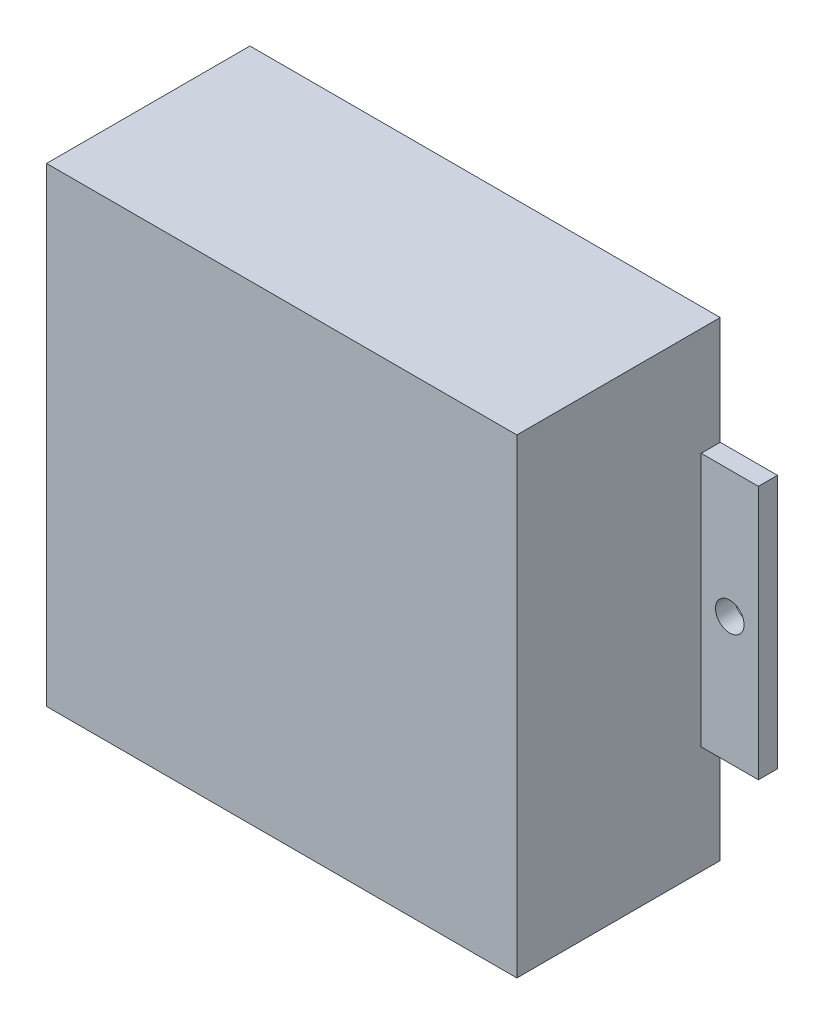
ISO-10303-21;
HEADER;
FILE_DESCRIPTION(('STEP AP214'),'2;1');
FILE_NAME('part.step','',(''),(''),'','','');
FILE_SCHEMA(('AUTOMOTIVE_DESIGN { 1 0 10303 214 1 1 1 1 }'));
ENDSEC;
DATA;
#1=APPLICATION_CONTEXT('core data for automotive mechanical design processes');
#2=APPLICATION_PROTOCOL_DEFINITION('international standard','automotive_design',2000,#1);
#3=PRODUCT_CONTEXT('',#1,'mechanical');
#4=PRODUCT('Part','Part','',(#3));
#5=PRODUCT_RELATED_PRODUCT_CATEGORY('part','',(#4));
#6=PRODUCT_DEFINITION_FORMATION('','',#4);
#7=PRODUCT_DEFINITION_CONTEXT('part definition',#1,'design');
#8=PRODUCT_DEFINITION('design','',#6,#7);
#9=PRODUCT_DEFINITION_SHAPE('','',#8);
#10=(LENGTH_UNIT() NAMED_UNIT(*) SI_UNIT(.MILLI.,.METRE.));
#11=(NAMED_UNIT(*) PLANE_ANGLE_UNIT() SI_UNIT($,.RADIAN.));
#12=(NAMED_UNIT(*) SI_UNIT($,.STERADIAN.) SOLID_ANGLE_UNIT());
#13=UNCERTAINTY_MEASURE_WITH_UNIT(LENGTH_MEASURE(1.E-05),#10,'distance_accuracy_value','');
#14=(GEOMETRIC_REPRESENTATION_CONTEXT(3) GLOBAL_UNCERTAINTY_ASSIGNED_CONTEXT((#13)) GLOBAL_UNIT_ASSIGNED_CONTEXT((#10,
#11,#12)) REPRESENTATION_CONTEXT('',''));
#15=CARTESIAN_POINT('',(0.,0.,0.));
#16=DIRECTION('',(0.,0.,1.));
#17=DIRECTION('',(1.,0.,0.));
#18=AXIS2_PLACEMENT_3D('',#15,#16,#17);
#19=CARTESIAN_POINT('',(41.5,-165.,188.8));
#20=DIRECTION('',(0.,0.,1.));
#21=DIRECTION('',(1.,0.,0.));
#22=AXIS2_PLACEMENT_3D('',#19,#20,#21);
#23=CYLINDRICAL_SURFACE('',#22,2.25);
#24=DIRECTION('',(0.,0.,1.));
#25=VECTOR('',#24,1.);
#26=CARTESIAN_POINT('',(43.75,-165.,188.8));
#27=LINE('',#26,#25);
#28=CARTESIAN_POINT('',(43.75,-165.,189.));
#29=VERTEX_POINT('',#28);
#30=CARTESIAN_POINT('',(43.75,-165.,192.));
#31=VERTEX_POINT('',#30);
#32=EDGE_CURVE('E10',#29,#31,#27,.T.);
#33=ORIENTED_EDGE('',*,*,#32,.F.);
#34=CARTESIAN_POINT('',(41.5,-165.,189.));
#35=DIRECTION('',(0.,0.,1.));
#36=DIRECTION('',(1.,0.,0.));
#37=AXIS2_PLACEMENT_3D('',#34,#35,#36);
#38=CIRCLE('',#37,2.25);
#39=EDGE_CURVE('E156',#29,#29,#38,.T.);
#40=ORIENTED_EDGE('',*,*,#39,.F.);
#41=ORIENTED_EDGE('',*,*,#32,.T.);
#42=CARTESIAN_POINT('',(41.5,-165.,192.));
#43=DIRECTION('',(0.,0.,1.));
#44=DIRECTION('',(1.,0.,0.));
#45=AXIS2_PLACEMENT_3D('',#42,#43,#44);
#46=CIRCLE('',#45,2.25);
#47=EDGE_CURVE('E249',#31,#31,#46,.T.);
#48=ORIENTED_EDGE('',*,*,#47,.T.);
#49=EDGE_LOOP('',(#33,#40,#41,#48));
#50=FACE_BOUND('',#49,.T.);
#51=ADVANCED_FACE('F15',(#50),#23,.F.);
#52=CARTESIAN_POINT('',(46.,-185.,189.));
#53=DIRECTION('',(1.,0.,0.));
#54=DIRECTION('',(0.,1.,0.));
#55=AXIS2_PLACEMENT_3D('',#52,#53,#54);
#56=PLANE('',#55);
#57=DIRECTION('',(0.,0.,1.));
#58=VECTOR('',#57,1.);
#59=CARTESIAN_POINT('',(46.,-185.,189.));
#60=LINE('',#59,#58);
#61=CARTESIAN_POINT('',(46.,-185.,189.));
#62=VERTEX_POINT('',#61);
#63=CARTESIAN_POINT('',(46.,-185.,192.));
#64=VERTEX_POINT('',#63);
#65=EDGE_CURVE('E26',#62,#64,#60,.T.);
#66=ORIENTED_EDGE('',*,*,#65,.F.);
#67=DIRECTION('',(0.,1.,0.));
#68=VECTOR('',#67,1.);
#69=CARTESIAN_POINT('',(46.,-185.,189.));
#70=LINE('',#69,#68);
#71=CARTESIAN_POINT('',(46.,-145.,189.));
#72=VERTEX_POINT('',#71);
#73=EDGE_CURVE('E186',#62,#72,#70,.T.);
#74=ORIENTED_EDGE('',*,*,#73,.T.);
#75=DIRECTION('',(0.,0.,1.));
#76=VECTOR('',#75,1.);
#77=CARTESIAN_POINT('',(46.,-145.,189.));
#78=LINE('',#77,#76);
#79=CARTESIAN_POINT('',(46.,-145.,192.));
#80=VERTEX_POINT('',#79);
#81=EDGE_CURVE('E209',#72,#80,#78,.T.);
#82=ORIENTED_EDGE('',*,*,#81,.T.);
#83=DIRECTION('',(0.,1.,0.));
#84=VECTOR('',#83,1.);
#85=CARTESIAN_POINT('',(46.,-185.,192.));
#86=LINE('',#85,#84);
#87=EDGE_CURVE('E247',#64,#80,#86,.T.);
#88=ORIENTED_EDGE('',*,*,#87,.F.);
#89=EDGE_LOOP('',(#66,#74,#82,#88));
#90=FACE_BOUND('',#89,.T.);
#91=ADVANCED_FACE('F352',(#90),#56,.T.);
#92=CARTESIAN_POINT('',(37.,-185.,189.));
#93=DIRECTION('',(0.,1.,0.));
#94=DIRECTION('',(1.,0.,0.));
#95=AXIS2_PLACEMENT_3D('',#92,#93,#94);
#96=PLANE('',#95);
#97=ORIENTED_EDGE('',*,*,#65,.T.);
#98=DIRECTION('',(1.,0.,0.));
#99=VECTOR('',#98,1.);
#100=CARTESIAN_POINT('',(37.,-185.,192.));
#101=LINE('',#100,#99);
#102=CARTESIAN_POINT('',(37.,-185.,192.));
#103=VERTEX_POINT('',#102);
#104=EDGE_CURVE('E222',#103,#64,#101,.T.);
#105=ORIENTED_EDGE('',*,*,#104,.F.);
#106=DIRECTION('',(0.,0.,1.));
#107=VECTOR('',#106,1.);
#108=CARTESIAN_POINT('',(37.,-185.,189.));
#109=LINE('',#108,#107);
#110=CARTESIAN_POINT('',(37.,-185.,189.));
#111=VERTEX_POINT('',#110);
#112=EDGE_CURVE('E237',#111,#103,#109,.T.);
#113=ORIENTED_EDGE('',*,*,#112,.F.);
#114=DIRECTION('',(1.,0.,0.));
#115=VECTOR('',#114,1.);
#116=CARTESIAN_POINT('',(37.,-185.,189.));
#117=LINE('',#116,#115);
#118=EDGE_CURVE('E262',#111,#62,#117,.T.);
#119=ORIENTED_EDGE('',*,*,#118,.T.);
#120=EDGE_LOOP('',(#97,#105,#113,#119));
#121=FACE_BOUND('',#120,.T.);
#122=ADVANCED_FACE('F17',(#121),#96,.F.);
#123=CARTESIAN_POINT('',(37.,-185.,192.));
#124=DIRECTION('',(0.,0.,1.));
#125=DIRECTION('',(1.,0.,0.));
#126=AXIS2_PLACEMENT_3D('',#123,#124,#125);
#127=PLANE('',#126);
#128=ORIENTED_EDGE('',*,*,#47,.F.);
#129=EDGE_LOOP('',(#128));
#130=FACE_BOUND('',#129,.T.);
#131=DIRECTION('',(0.,1.,0.));
#132=VECTOR('',#131,1.);
#133=CARTESIAN_POINT('',(37.,-185.,192.));
#134=LINE('',#133,#132);
#135=CARTESIAN_POINT('',(37.,-145.,192.));
#136=VERTEX_POINT('',#135);
#137=EDGE_CURVE('E233',#103,#136,#134,.T.);
#138=ORIENTED_EDGE('',*,*,#137,.F.);
#139=ORIENTED_EDGE('',*,*,#104,.T.);
#140=ORIENTED_EDGE('',*,*,#87,.T.);
#141=DIRECTION('',(1.,0.,0.));
#142=VECTOR('',#141,1.);
#143=CARTESIAN_POINT('',(37.,-145.,192.));
#144=LINE('',#143,#142);
#145=EDGE_CURVE('E149',#136,#80,#144,.T.);
#146=ORIENTED_EDGE('',*,*,#145,.F.);
#147=EDGE_LOOP('',(#138,#139,#140,#146));
#148=FACE_BOUND('',#147,.T.);
#149=ADVANCED_FACE('F297',(#130,#148),#127,.T.);
#150=CARTESIAN_POINT('',(37.,-145.,189.));
#151=DIRECTION('',(0.,1.,0.));
#152=DIRECTION('',(1.,0.,0.));
#153=AXIS2_PLACEMENT_3D('',#150,#151,#152);
#154=PLANE('',#153);
#155=DIRECTION('',(1.,0.,0.));
#156=VECTOR('',#155,1.);
#157=CARTESIAN_POINT('',(37.,-145.,189.));
#158=LINE('',#157,#156);
#159=CARTESIAN_POINT('',(37.,-145.,189.));
#160=VERTEX_POINT('',#159);
#161=EDGE_CURVE('E182',#160,#72,#158,.T.);
#162=ORIENTED_EDGE('',*,*,#161,.F.);
#163=DIRECTION('',(0.,0.,1.));
#164=VECTOR('',#163,1.);
#165=CARTESIAN_POINT('',(37.,-145.,189.));
#166=LINE('',#165,#164);
#167=EDGE_CURVE('E150',#160,#136,#166,.T.);
#168=ORIENTED_EDGE('',*,*,#167,.T.);
#169=ORIENTED_EDGE('',*,*,#145,.T.);
#170=ORIENTED_EDGE('',*,*,#81,.F.);
#171=EDGE_LOOP('',(#162,#168,#169,#170));
#172=FACE_BOUND('',#171,.T.);
#173=ADVANCED_FACE('F300',(#172),#154,.T.);
#174=CARTESIAN_POINT('',(-41.5,-165.,188.8));
#175=DIRECTION('',(0.,0.,1.));
#176=DIRECTION('',(1.,0.,0.));
#177=AXIS2_PLACEMENT_3D('',#174,#175,#176);
#178=CYLINDRICAL_SURFACE('',#177,2.25);
#179=DIRECTION('',(0.,0.,1.));
#180=VECTOR('',#179,1.);
#181=CARTESIAN_POINT('',(-39.25,-165.,188.8));
#182=LINE('',#181,#180);
#183=CARTESIAN_POINT('',(-39.25,-165.,189.));
#184=VERTEX_POINT('',#183);
#185=CARTESIAN_POINT('',(-39.25,-165.,192.));
#186=VERTEX_POINT('',#185);
#187=EDGE_CURVE('E142',#184,#186,#182,.T.);
#188=ORIENTED_EDGE('',*,*,#187,.F.);
#189=CARTESIAN_POINT('',(-41.5,-165.,189.));
#190=DIRECTION('',(0.,0.,1.));
#191=DIRECTION('',(1.,0.,0.));
#192=AXIS2_PLACEMENT_3D('',#189,#190,#191);
#193=CIRCLE('',#192,2.25);
#194=EDGE_CURVE('E145',#184,#184,#193,.T.);
#195=ORIENTED_EDGE('',*,*,#194,.F.);
#196=ORIENTED_EDGE('',*,*,#187,.T.);
#197=CARTESIAN_POINT('',(-41.5,-165.,192.));
#198=DIRECTION('',(0.,0.,1.));
#199=DIRECTION('',(1.,0.,0.));
#200=AXIS2_PLACEMENT_3D('',#197,#198,#199);
#201=CIRCLE('',#200,2.25);
#202=EDGE_CURVE('E147',#186,#186,#201,.T.);
#203=ORIENTED_EDGE('',*,*,#202,.T.);
#204=EDGE_LOOP('',(#188,#195,#196,#203));
#205=FACE_BOUND('',#204,.T.);
#206=ADVANCED_FACE('F144',(#205),#178,.F.);
#207=CARTESIAN_POINT('',(-46.,-185.,189.));
#208=DIRECTION('',(1.,0.,0.));
#209=DIRECTION('',(0.,1.,0.));
#210=AXIS2_PLACEMENT_3D('',#207,#208,#209);
#211=PLANE('',#210);
#212=DIRECTION('',(0.,1.,0.));
#213=VECTOR('',#212,1.);
#214=CARTESIAN_POINT('',(-46.,-185.,192.));
#215=LINE('',#214,#213);
#216=CARTESIAN_POINT('',(-46.,-185.,192.));
#217=VERTEX_POINT('',#216);
#218=CARTESIAN_POINT('',(-46.,-145.,192.));
#219=VERTEX_POINT('',#218);
#220=EDGE_CURVE('E174',#217,#219,#215,.T.);
#221=ORIENTED_EDGE('',*,*,#220,.T.);
#222=DIRECTION('',(0.,0.,1.));
#223=VECTOR('',#222,1.);
#224=CARTESIAN_POINT('',(-46.,-145.,189.));
#225=LINE('',#224,#223);
#226=CARTESIAN_POINT('',(-46.,-145.,189.));
#227=VERTEX_POINT('',#226);
#228=EDGE_CURVE('E164',#227,#219,#225,.T.);
#229=ORIENTED_EDGE('',*,*,#228,.F.);
#230=DIRECTION('',(0.,1.,0.));
#231=VECTOR('',#230,1.);
#232=CARTESIAN_POINT('',(-46.,-185.,189.));
#233=LINE('',#232,#231);
#234=CARTESIAN_POINT('',(-46.,-185.,189.));
#235=VERTEX_POINT('',#234);
#236=EDGE_CURVE('E275',#235,#227,#233,.T.);
#237=ORIENTED_EDGE('',*,*,#236,.F.);
#238=DIRECTION('',(0.,0.,1.));
#239=VECTOR('',#238,1.);
#240=CARTESIAN_POINT('',(-46.,-185.,189.));
#241=LINE('',#240,#239);
#242=EDGE_CURVE('E254',#235,#217,#241,.T.);
#243=ORIENTED_EDGE('',*,*,#242,.T.);
#244=EDGE_LOOP('',(#221,#229,#237,#243));
#245=FACE_BOUND('',#244,.T.);
#246=ADVANCED_FACE('F338',(#245),#211,.F.);
#247=CARTESIAN_POINT('',(37.,-202.,189.));
#248=DIRECTION('',(1.,0.,0.));
#249=DIRECTION('',(0.,1.,0.));
#250=AXIS2_PLACEMENT_3D('',#247,#248,#249);
#251=PLANE('',#250);
#252=DIRECTION('',(0.,1.,0.));
#253=VECTOR('',#252,1.);
#254=CARTESIAN_POINT('',(37.,-202.,221.));
#255=LINE('',#254,#253);
#256=CARTESIAN_POINT('',(37.,-202.,221.));
#257=VERTEX_POINT('',#256);
#258=CARTESIAN_POINT('',(37.,-128.,221.));
#259=VERTEX_POINT('',#258);
#260=EDGE_CURVE('E205',#257,#259,#255,.T.);
#261=ORIENTED_EDGE('',*,*,#260,.F.);
#262=DIRECTION('',(0.,0.,1.));
#263=VECTOR('',#262,1.);
#264=CARTESIAN_POINT('',(37.,-202.,189.));
#265=LINE('',#264,#263);
#266=CARTESIAN_POINT('',(37.,-202.,189.));
#267=VERTEX_POINT('',#266);
#268=EDGE_CURVE('E251',#267,#257,#265,.T.);
#269=ORIENTED_EDGE('',*,*,#268,.F.);
#270=DIRECTION('',(0.,1.,0.));
#271=VECTOR('',#270,1.);
#272=CARTESIAN_POINT('',(37.,-202.,189.));
#273=LINE('',#272,#271);
#274=EDGE_CURVE('E168',#267,#111,#273,.T.);
#275=ORIENTED_EDGE('',*,*,#274,.T.);
#276=ORIENTED_EDGE('',*,*,#112,.T.);
#277=ORIENTED_EDGE('',*,*,#137,.T.);
#278=ORIENTED_EDGE('',*,*,#167,.F.);
#279=DIRECTION('',(0.,1.,0.));
#280=VECTOR('',#279,1.);
#281=CARTESIAN_POINT('',(37.,-202.,189.));
#282=LINE('',#281,#280);
#283=CARTESIAN_POINT('',(37.,-128.,189.));
#284=VERTEX_POINT('',#283);
#285=EDGE_CURVE('E187',#160,#284,#282,.T.);
#286=ORIENTED_EDGE('',*,*,#285,.T.);
#287=DIRECTION('',(0.,0.,1.));
#288=VECTOR('',#287,1.);
#289=CARTESIAN_POINT('',(37.,-128.,189.));
#290=LINE('',#289,#288);
#291=EDGE_CURVE('E223',#284,#259,#290,.T.);
#292=ORIENTED_EDGE('',*,*,#291,.T.);
#293=EDGE_LOOP('',(#261,#269,#275,#276,#277,#278,#286,#292));
#294=FACE_BOUND('',#293,.T.);
#295=ADVANCED_FACE('F289',(#294),#251,.T.);
#296=CARTESIAN_POINT('',(-37.,-202.,189.));
#297=DIRECTION('',(0.,1.,0.));
#298=DIRECTION('',(1.,0.,0.));
#299=AXIS2_PLACEMENT_3D('',#296,#297,#298);
#300=PLANE('',#299);
#301=ORIENTED_EDGE('',*,*,#268,.T.);
#302=DIRECTION('',(1.,0.,0.));
#303=VECTOR('',#302,1.);
#304=CARTESIAN_POINT('',(-37.,-202.,221.));
#305=LINE('',#304,#303);
#306=CARTESIAN_POINT('',(-37.,-202.,221.));
#307=VERTEX_POINT('',#306);
#308=EDGE_CURVE('E201',#307,#257,#305,.T.);
#309=ORIENTED_EDGE('',*,*,#308,.F.);
#310=DIRECTION('',(0.,0.,1.));
#311=VECTOR('',#310,1.);
#312=CARTESIAN_POINT('',(-37.,-202.,189.));
#313=LINE('',#312,#311);
#314=CARTESIAN_POINT('',(-37.,-202.,189.));
#315=VERTEX_POINT('',#314);
#316=EDGE_CURVE('E176',#315,#307,#313,.T.);
#317=ORIENTED_EDGE('',*,*,#316,.F.);
#318=DIRECTION('',(1.,0.,0.));
#319=VECTOR('',#318,1.);
#320=CARTESIAN_POINT('',(-37.,-202.,189.));
#321=LINE('',#320,#319);
#322=EDGE_CURVE('E157',#315,#267,#321,.T.);
#323=ORIENTED_EDGE('',*,*,#322,.T.);
#324=EDGE_LOOP('',(#301,#309,#317,#323));
#325=FACE_BOUND('',#324,.T.);
#326=ADVANCED_FACE('F401',(#325),#300,.F.);
#327=CARTESIAN_POINT('',(-46.,-185.,189.));
#328=DIRECTION('',(0.,1.,0.));
#329=DIRECTION('',(1.,0.,0.));
#330=AXIS2_PLACEMENT_3D('',#327,#328,#329);
#331=PLANE('',#330);
#332=DIRECTION('',(0.,0.,1.));
#333=VECTOR('',#332,1.);
#334=CARTESIAN_POINT('',(-37.,-185.,189.));
#335=LINE('',#334,#333);
#336=CARTESIAN_POINT('',(-37.,-185.,189.));
#337=VERTEX_POINT('',#336);
#338=CARTESIAN_POINT('',(-37.,-185.,192.));
#339=VERTEX_POINT('',#338);
#340=EDGE_CURVE('E195',#337,#339,#335,.T.);
#341=ORIENTED_EDGE('',*,*,#340,.T.);
#342=DIRECTION('',(1.,0.,0.));
#343=VECTOR('',#342,1.);
#344=CARTESIAN_POINT('',(-46.,-185.,192.));
#345=LINE('',#344,#343);
#346=EDGE_CURVE('E212',#217,#339,#345,.T.);
#347=ORIENTED_EDGE('',*,*,#346,.F.);
#348=ORIENTED_EDGE('',*,*,#242,.F.);
#349=DIRECTION('',(1.,0.,0.));
#350=VECTOR('',#349,1.);
#351=CARTESIAN_POINT('',(-46.,-185.,189.));
#352=LINE('',#351,#350);
#353=EDGE_CURVE('E19',#235,#337,#352,.T.);
#354=ORIENTED_EDGE('',*,*,#353,.T.);
#355=EDGE_LOOP('',(#341,#347,#348,#354));
#356=FACE_BOUND('',#355,.T.);
#357=ADVANCED_FACE('F323',(#356),#331,.F.);
#358=CARTESIAN_POINT('',(-46.,-185.,192.));
#359=DIRECTION('',(0.,0.,1.));
#360=DIRECTION('',(1.,0.,0.));
#361=AXIS2_PLACEMENT_3D('',#358,#359,#360);
#362=PLANE('',#361);
#363=ORIENTED_EDGE('',*,*,#202,.F.);
#364=EDGE_LOOP('',(#363));
#365=FACE_BOUND('',#364,.T.);
#366=ORIENTED_EDGE('',*,*,#220,.F.);
#367=ORIENTED_EDGE('',*,*,#346,.T.);
#368=DIRECTION('',(0.,1.,0.));
#369=VECTOR('',#368,1.);
#370=CARTESIAN_POINT('',(-37.,-185.,192.));
#371=LINE('',#370,#369);
#372=CARTESIAN_POINT('',(-37.,-145.,192.));
#373=VERTEX_POINT('',#372);
#374=EDGE_CURVE('E191',#339,#373,#371,.T.);
#375=ORIENTED_EDGE('',*,*,#374,.T.);
#376=DIRECTION('',(1.,0.,0.));
#377=VECTOR('',#376,1.);
#378=CARTESIAN_POINT('',(-46.,-145.,192.));
#379=LINE('',#378,#377);
#380=EDGE_CURVE('E173',#219,#373,#379,.T.);
#381=ORIENTED_EDGE('',*,*,#380,.F.);
#382=EDGE_LOOP('',(#366,#367,#375,#381));
#383=FACE_BOUND('',#382,.T.);
#384=ADVANCED_FACE('F336',(#365,#383),#362,.T.);
#385=CARTESIAN_POINT('',(-46.,-145.,189.));
#386=DIRECTION('',(0.,1.,0.));
#387=DIRECTION('',(1.,0.,0.));
#388=AXIS2_PLACEMENT_3D('',#385,#386,#387);
#389=PLANE('',#388);
#390=DIRECTION('',(1.,0.,0.));
#391=VECTOR('',#390,1.);
#392=CARTESIAN_POINT('',(-46.,-145.,189.));
#393=LINE('',#392,#391);
#394=CARTESIAN_POINT('',(-37.,-145.,189.));
#395=VERTEX_POINT('',#394);
#396=EDGE_CURVE('E218',#227,#395,#393,.T.);
#397=ORIENTED_EDGE('',*,*,#396,.F.);
#398=ORIENTED_EDGE('',*,*,#228,.T.);
#399=ORIENTED_EDGE('',*,*,#380,.T.);
#400=DIRECTION('',(0.,0.,1.));
#401=VECTOR('',#400,1.);
#402=CARTESIAN_POINT('',(-37.,-145.,189.));
#403=LINE('',#402,#401);
#404=EDGE_CURVE('E196',#395,#373,#403,.T.);
#405=ORIENTED_EDGE('',*,*,#404,.F.);
#406=EDGE_LOOP('',(#397,#398,#399,#405));
#407=FACE_BOUND('',#406,.T.);
#408=ADVANCED_FACE('F344',(#407),#389,.T.);
#409=CARTESIAN_POINT('',(-37.,-202.,189.));
#410=DIRECTION('',(0.,0.,1.));
#411=DIRECTION('',(1.,0.,0.));
#412=AXIS2_PLACEMENT_3D('',#409,#410,#411);
#413=PLANE('',#412);
#414=ORIENTED_EDGE('',*,*,#39,.T.);
#415=EDGE_LOOP('',(#414));
#416=FACE_BOUND('',#415,.T.);
#417=ORIENTED_EDGE('',*,*,#194,.T.);
#418=EDGE_LOOP('',(#417));
#419=FACE_BOUND('',#418,.T.);
#420=ORIENTED_EDGE('',*,*,#353,.F.);
#421=ORIENTED_EDGE('',*,*,#236,.T.);
#422=ORIENTED_EDGE('',*,*,#396,.T.);
#423=DIRECTION('',(0.,1.,0.));
#424=VECTOR('',#423,1.);
#425=CARTESIAN_POINT('',(-37.,-202.,189.));
#426=LINE('',#425,#424);
#427=CARTESIAN_POINT('',(-37.,-128.,189.));
#428=VERTEX_POINT('',#427);
#429=EDGE_CURVE('E200',#395,#428,#426,.T.);
#430=ORIENTED_EDGE('',*,*,#429,.T.);
#431=DIRECTION('',(1.,0.,0.));
#432=VECTOR('',#431,1.);
#433=CARTESIAN_POINT('',(-37.,-128.,189.));
#434=LINE('',#433,#432);
#435=EDGE_CURVE('E226',#428,#284,#434,.T.);
#436=ORIENTED_EDGE('',*,*,#435,.T.);
#437=ORIENTED_EDGE('',*,*,#285,.F.);
#438=ORIENTED_EDGE('',*,*,#161,.T.);
#439=ORIENTED_EDGE('',*,*,#73,.F.);
#440=ORIENTED_EDGE('',*,*,#118,.F.);
#441=ORIENTED_EDGE('',*,*,#274,.F.);
#442=ORIENTED_EDGE('',*,*,#322,.F.);
#443=DIRECTION('',(0.,1.,0.));
#444=VECTOR('',#443,1.);
#445=CARTESIAN_POINT('',(-37.,-202.,189.));
#446=LINE('',#445,#444);
#447=EDGE_CURVE('E181',#315,#337,#446,.T.);
#448=ORIENTED_EDGE('',*,*,#447,.T.);
#449=EDGE_LOOP('',(#420,#421,#422,#430,#436,#437,#438,#439,#440,#441,#442,#448));
#450=FACE_BOUND('',#449,.T.);
#451=ADVANCED_FACE('F153',(#416,#419,#450),#413,.F.);
#452=CARTESIAN_POINT('',(-37.,-128.,189.));
#453=DIRECTION('',(0.,1.,0.));
#454=DIRECTION('',(1.,0.,0.));
#455=AXIS2_PLACEMENT_3D('',#452,#453,#454);
#456=PLANE('',#455);
#457=ORIENTED_EDGE('',*,*,#435,.F.);
#458=DIRECTION('',(0.,0.,1.));
#459=VECTOR('',#458,1.);
#460=CARTESIAN_POINT('',(-37.,-128.,189.));
#461=LINE('',#460,#459);
#462=CARTESIAN_POINT('',(-37.,-128.,221.));
#463=VERTEX_POINT('',#462);
#464=EDGE_CURVE('E255',#428,#463,#461,.T.);
#465=ORIENTED_EDGE('',*,*,#464,.T.);
#466=DIRECTION('',(1.,0.,0.));
#467=VECTOR('',#466,1.);
#468=CARTESIAN_POINT('',(-37.,-128.,221.));
#469=LINE('',#468,#467);
#470=EDGE_CURVE('E229',#463,#259,#469,.T.);
#471=ORIENTED_EDGE('',*,*,#470,.T.);
#472=ORIENTED_EDGE('',*,*,#291,.F.);
#473=EDGE_LOOP('',(#457,#465,#471,#472));
#474=FACE_BOUND('',#473,.T.);
#475=ADVANCED_FACE('F305',(#474),#456,.T.);
#476=CARTESIAN_POINT('',(-37.,-202.,221.));
#477=DIRECTION('',(0.,0.,1.));
#478=DIRECTION('',(1.,0.,0.));
#479=AXIS2_PLACEMENT_3D('',#476,#477,#478);
#480=PLANE('',#479);
#481=DIRECTION('',(0.,1.,0.));
#482=VECTOR('',#481,1.);
#483=CARTESIAN_POINT('',(-37.,-202.,221.));
#484=LINE('',#483,#482);
#485=EDGE_CURVE('E180',#307,#463,#484,.T.);
#486=ORIENTED_EDGE('',*,*,#485,.F.);
#487=ORIENTED_EDGE('',*,*,#308,.T.);
#488=ORIENTED_EDGE('',*,*,#260,.T.);
#489=ORIENTED_EDGE('',*,*,#470,.F.);
#490=EDGE_LOOP('',(#486,#487,#488,#489));
#491=FACE_BOUND('',#490,.T.);
#492=ADVANCED_FACE('F373',(#491),#480,.T.);
#493=CARTESIAN_POINT('',(-37.,-202.,189.));
#494=DIRECTION('',(1.,0.,0.));
#495=DIRECTION('',(0.,1.,0.));
#496=AXIS2_PLACEMENT_3D('',#493,#494,#495);
#497=PLANE('',#496);
#498=ORIENTED_EDGE('',*,*,#464,.F.);
#499=ORIENTED_EDGE('',*,*,#429,.F.);
#500=ORIENTED_EDGE('',*,*,#404,.T.);
#501=ORIENTED_EDGE('',*,*,#374,.F.);
#502=ORIENTED_EDGE('',*,*,#340,.F.);
#503=ORIENTED_EDGE('',*,*,#447,.F.);
#504=ORIENTED_EDGE('',*,*,#316,.T.);
#505=ORIENTED_EDGE('',*,*,#485,.T.);
#506=EDGE_LOOP('',(#498,#499,#500,#501,#502,#503,#504,#505));
#507=FACE_BOUND('',#506,.T.);
#508=ADVANCED_FACE('F331',(#507),#497,.F.);
#509=CLOSED_SHELL('',(#51,#91,#122,#149,#173,#206,#246,#295,#326,#357,#384,#408,#451,#475,#492,#508));
#510=MANIFOLD_SOLID_BREP('B1',#509);
#511=ADVANCED_BREP_SHAPE_REPRESENTATION('',(#18,#510),#14);
#512=SHAPE_DEFINITION_REPRESENTATION(#9,#511);
ENDSEC;
END-ISO-10303-21;
